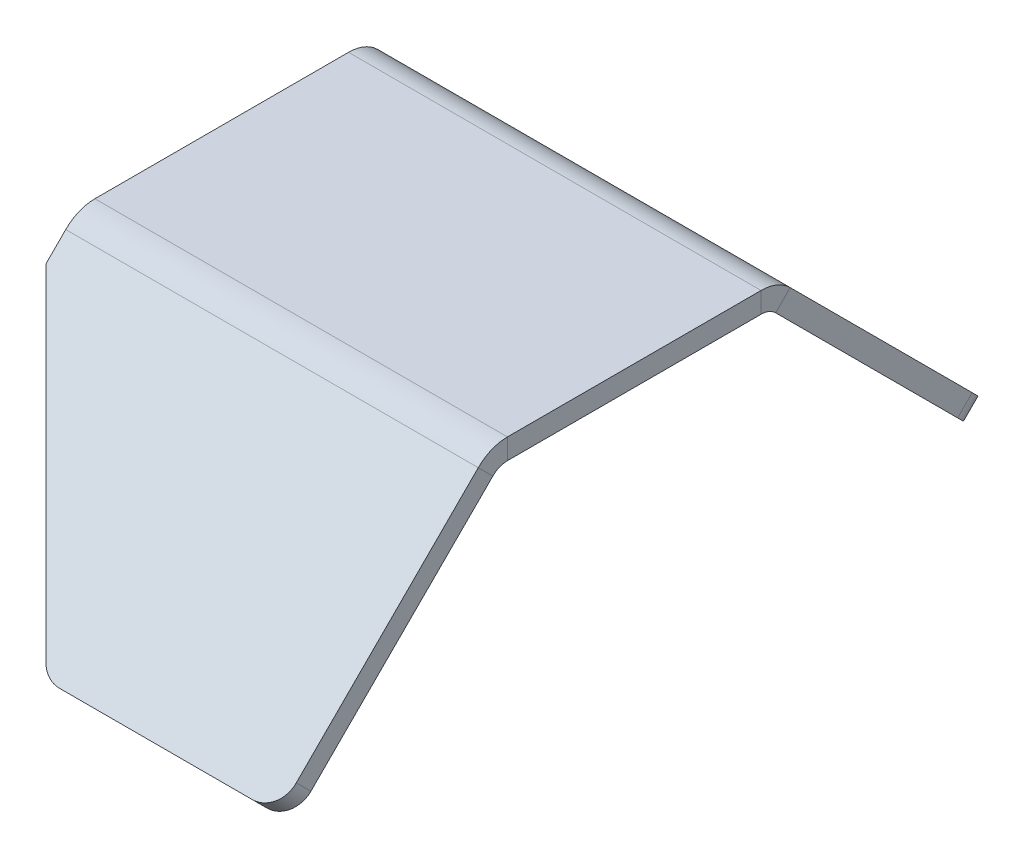
ISO-10303-21;
HEADER;
FILE_DESCRIPTION(('STEP AP214'),'2;1');
FILE_NAME('part.step','',(''),(''),'','','');
FILE_SCHEMA(('AUTOMOTIVE_DESIGN { 1 0 10303 214 1 1 1 1 }'));
ENDSEC;
DATA;
#1=APPLICATION_CONTEXT('core data for automotive mechanical design processes');
#2=APPLICATION_PROTOCOL_DEFINITION('international standard','automotive_design',2000,#1);
#3=PRODUCT_CONTEXT('',#1,'mechanical');
#4=PRODUCT('Part','Part','',(#3));
#5=PRODUCT_RELATED_PRODUCT_CATEGORY('part','',(#4));
#6=PRODUCT_DEFINITION_FORMATION('','',#4);
#7=PRODUCT_DEFINITION_CONTEXT('part definition',#1,'design');
#8=PRODUCT_DEFINITION('design','',#6,#7);
#9=PRODUCT_DEFINITION_SHAPE('','',#8);
#10=(LENGTH_UNIT() NAMED_UNIT(*) SI_UNIT(.MILLI.,.METRE.));
#11=(NAMED_UNIT(*) PLANE_ANGLE_UNIT() SI_UNIT($,.RADIAN.));
#12=(NAMED_UNIT(*) SI_UNIT($,.STERADIAN.) SOLID_ANGLE_UNIT());
#13=UNCERTAINTY_MEASURE_WITH_UNIT(LENGTH_MEASURE(1.E-05),#10,'distance_accuracy_value','');
#14=(GEOMETRIC_REPRESENTATION_CONTEXT(3) GLOBAL_UNCERTAINTY_ASSIGNED_CONTEXT((#13)) GLOBAL_UNIT_ASSIGNED_CONTEXT((#10,
#11,#12)) REPRESENTATION_CONTEXT('',''));
#15=CARTESIAN_POINT('',(0.,0.,0.));
#16=DIRECTION('',(0.,0.,1.));
#17=DIRECTION('',(1.,0.,0.));
#18=AXIS2_PLACEMENT_3D('',#15,#16,#17);
#19=CARTESIAN_POINT('',(0.,8.00000000000001,-49.1862915010152));
#20=DIRECTION('',(-1.,0.,0.));
#21=DIRECTION('',(0.,0.,1.));
#22=AXIS2_PLACEMENT_3D('',#19,#20,#21);
#23=PLANE('',#22);
#24=DIRECTION('',(0.,0.707106781186544,0.707106781186551));
#25=VECTOR('',#24,1.);
#26=CARTESIAN_POINT('',(0.,5.65685424949242,-58.1568542494924));
#27=LINE('',#26,#25);
#28=CARTESIAN_POINT('',(0.,-4.34314575050755,-68.1568542494924));
#29=VERTEX_POINT('',#28);
#30=CARTESIAN_POINT('',(0.,3.31370849898484,-60.4999999999999));
#31=VERTEX_POINT('',#30);
#32=EDGE_CURVE('E206',#29,#31,#27,.T.);
#33=ORIENTED_EDGE('',*,*,#32,.F.);
#34=DIRECTION('',(0.,-0.707106781186551,0.707106781186544));
#35=VECTOR('',#34,1.);
#36=CARTESIAN_POINT('',(0.,-9.99999999999998,-62.5000000000001));
#37=LINE('',#36,#35);
#38=CARTESIAN_POINT('',(0.,-9.99999999999998,-62.5000000000001));
#39=VERTEX_POINT('',#38);
#40=EDGE_CURVE('E187',#39,#29,#37,.F.);
#41=ORIENTED_EDGE('',*,*,#40,.F.);
#42=DIRECTION('',(0.,0.707106781186544,0.707106781186551));
#43=VECTOR('',#42,1.);
#44=CARTESIAN_POINT('',(0.,0.,-52.5));
#45=LINE('',#44,#43);
#46=CARTESIAN_POINT('',(0.,-2.34314575050756,-54.8431457505076));
#47=VERTEX_POINT('',#46);
#48=EDGE_CURVE('E204',#39,#47,#45,.T.);
#49=ORIENTED_EDGE('',*,*,#48,.T.);
#50=DIRECTION('',(0.,0.707106781186551,-0.707106781186544));
#51=VECTOR('',#50,1.);
#52=CARTESIAN_POINT('',(0.,-2.34314575050756,-54.8431457505076));
#53=LINE('',#52,#51);
#54=EDGE_CURVE('E261',#47,#31,#53,.T.);
#55=ORIENTED_EDGE('',*,*,#54,.T.);
#56=EDGE_LOOP('',(#33,#41,#49,#55));
#57=FACE_BOUND('',#56,.T.);
#58=ADVANCED_FACE('F38',(#57),#23,.T.);
#59=CARTESIAN_POINT('',(160.,5.65685424949241,58.1568542494924));
#60=DIRECTION('',(0.,-0.707106781186551,-0.707106781186544));
#61=DIRECTION('',(0.,0.707106781186544,-0.707106781186551));
#62=AXIS2_PLACEMENT_3D('',#59,#60,#61);
#63=PLANE('',#62);
#64=DIRECTION('',(-1.,0.,0.));
#65=VECTOR('',#64,1.);
#66=CARTESIAN_POINT('',(160.,-74.3431457505076,138.156854249493));
#67=LINE('',#66,#65);
#68=CARTESIAN_POINT('',(150.,-74.3431457505076,138.156854249493));
#69=VERTEX_POINT('',#68);
#70=CARTESIAN_POINT('',(75.1763809020504,-74.3431457505076,138.156854249493));
#71=VERTEX_POINT('',#70);
#72=EDGE_CURVE('E249',#69,#71,#67,.T.);
#73=ORIENTED_EDGE('',*,*,#72,.F.);
#74=CARTESIAN_POINT('',(150.,-67.2720779386421,131.085786437628));
#75=DIRECTION('',(0.,-0.707106781186551,-0.707106781186544));
#76=DIRECTION('',(0.,0.707106781186544,-0.707106781186551));
#77=AXIS2_PLACEMENT_3D('',#74,#75,#76);
#78=CIRCLE('',#77,10.);
#79=CARTESIAN_POINT('',(160.,-67.2720779386422,131.085786437628));
#80=VERTEX_POINT('',#79);
#81=EDGE_CURVE('E276',#69,#80,#78,.F.);
#82=ORIENTED_EDGE('',*,*,#81,.T.);
#83=DIRECTION('',(0.,-0.707106781186544,0.707106781186551));
#84=VECTOR('',#83,1.);
#85=CARTESIAN_POINT('',(160.,5.65685424949241,58.1568542494924));
#86=LINE('',#85,#84);
#87=CARTESIAN_POINT('',(160.,3.31370849898482,60.5));
#88=VERTEX_POINT('',#87);
#89=EDGE_CURVE('E217',#88,#80,#86,.T.);
#90=ORIENTED_EDGE('',*,*,#89,.F.);
#91=DIRECTION('',(-1.,0.,0.));
#92=VECTOR('',#91,1.);
#93=CARTESIAN_POINT('',(160.,3.31370849898482,60.5));
#94=LINE('',#93,#92);
#95=CARTESIAN_POINT('',(0.,3.31370849898482,60.5));
#96=VERTEX_POINT('',#95);
#97=EDGE_CURVE('E218',#88,#96,#94,.T.);
#98=ORIENTED_EDGE('',*,*,#97,.T.);
#99=DIRECTION('',(0.,-0.707106781186544,0.707106781186551));
#100=VECTOR('',#99,1.);
#101=CARTESIAN_POINT('',(0.,5.65685424949241,58.1568542494924));
#102=LINE('',#101,#100);
#103=CARTESIAN_POINT('',(0.,-4.34314575050758,68.1568542494924));
#104=VERTEX_POINT('',#103);
#105=EDGE_CURVE('E175',#96,#104,#102,.T.);
#106=ORIENTED_EDGE('',*,*,#105,.T.);
#107=DIRECTION('',(0.577350269189624,-0.577350269189624,0.57735026918963));
#108=VECTOR('',#107,1.);
#109=CARTESIAN_POINT('',(46.6666666666663,-51.0098124171739,114.823520916159));
#110=LINE('',#109,#108);
#111=CARTESIAN_POINT('',(67.0114150927731,-71.3545608432807,135.168269342266));
#112=VERTEX_POINT('',#111);
#113=EDGE_CURVE('E170',#104,#112,#110,.T.);
#114=ORIENTED_EDGE('',*,*,#113,.T.);
#115=CARTESIAN_POINT('',(75.1763809020504,-67.2720779386421,131.085786437628));
#116=DIRECTION('',(0.,-0.707106781186551,-0.707106781186544));
#117=DIRECTION('',(0.,0.707106781186544,-0.707106781186551));
#118=AXIS2_PLACEMENT_3D('',#115,#116,#117);
#119=CIRCLE('',#118,10.);
#120=EDGE_CURVE('E274',#112,#71,#119,.F.);
#121=ORIENTED_EDGE('',*,*,#120,.T.);
#122=EDGE_LOOP('',(#73,#82,#90,#98,#106,#114,#121));
#123=FACE_BOUND('',#122,.T.);
#124=ADVANCED_FACE('F353',(#123),#63,.F.);
#125=CARTESIAN_POINT('',(160.,-80.,132.500000000001));
#126=DIRECTION('',(0.,-0.707106781186542,0.707106781186554));
#127=DIRECTION('',(0.,-0.707106781186554,-0.707106781186542));
#128=AXIS2_PLACEMENT_3D('',#125,#126,#127);
#129=PLANE('',#128);
#130=DIRECTION('',(-1.,0.,0.));
#131=VECTOR('',#130,1.);
#132=CARTESIAN_POINT('',(160.,-80.,132.500000000001));
#133=LINE('',#132,#131);
#134=CARTESIAN_POINT('',(150.,-80.,132.500000000001));
#135=VERTEX_POINT('',#134);
#136=CARTESIAN_POINT('',(75.1763809020505,-80.,132.500000000001));
#137=VERTEX_POINT('',#136);
#138=EDGE_CURVE('E247',#135,#137,#133,.T.);
#139=ORIENTED_EDGE('',*,*,#138,.F.);
#140=DIRECTION('',(0.,0.707106781186554,0.707106781186542));
#141=VECTOR('',#140,1.);
#142=CARTESIAN_POINT('',(150.,-80.,132.500000000001));
#143=LINE('',#142,#141);
#144=EDGE_CURVE('E271',#135,#69,#143,.T.);
#145=ORIENTED_EDGE('',*,*,#144,.T.);
#146=ORIENTED_EDGE('',*,*,#72,.T.);
#147=DIRECTION('',(0.,-0.707106781186554,-0.707106781186542));
#148=VECTOR('',#147,1.);
#149=CARTESIAN_POINT('',(75.1763809020505,-80.0000000000002,132.500000000001));
#150=LINE('',#149,#148);
#151=EDGE_CURVE('E269',#71,#137,#150,.T.);
#152=ORIENTED_EDGE('',*,*,#151,.T.);
#153=EDGE_LOOP('',(#139,#145,#146,#152));
#154=FACE_BOUND('',#153,.T.);
#155=ADVANCED_FACE('F406',(#154),#129,.T.);
#156=CARTESIAN_POINT('',(160.,0.,52.5));
#157=DIRECTION('',(0.,-0.707106781186551,-0.707106781186544));
#158=DIRECTION('',(0.,0.707106781186544,-0.707106781186551));
#159=AXIS2_PLACEMENT_3D('',#156,#157,#158);
#160=PLANE('',#159);
#161=DIRECTION('',(0.,-0.707106781186544,0.707106781186551));
#162=VECTOR('',#161,1.);
#163=CARTESIAN_POINT('',(160.,0.,52.5));
#164=LINE('',#163,#162);
#165=CARTESIAN_POINT('',(160.,-2.34314575050759,54.8431457505076));
#166=VERTEX_POINT('',#165);
#167=CARTESIAN_POINT('',(160.,-72.9289321881346,125.428932188135));
#168=VERTEX_POINT('',#167);
#169=EDGE_CURVE('E356',#166,#168,#164,.T.);
#170=ORIENTED_EDGE('',*,*,#169,.T.);
#171=CARTESIAN_POINT('',(150.,-72.9289321881346,125.428932188135));
#172=DIRECTION('',(0.,-0.707106781186551,-0.707106781186544));
#173=DIRECTION('',(0.,0.707106781186544,-0.707106781186551));
#174=AXIS2_PLACEMENT_3D('',#171,#172,#173);
#175=CIRCLE('',#174,10.);
#176=EDGE_CURVE('E281',#168,#135,#175,.T.);
#177=ORIENTED_EDGE('',*,*,#176,.T.);
#178=ORIENTED_EDGE('',*,*,#138,.T.);
#179=CARTESIAN_POINT('',(75.1763809020505,-72.9289321881346,125.428932188135));
#180=DIRECTION('',(0.,-0.707106781186551,-0.707106781186544));
#181=DIRECTION('',(0.,0.707106781186544,-0.707106781186551));
#182=AXIS2_PLACEMENT_3D('',#179,#180,#181);
#183=CIRCLE('',#182,10.);
#184=CARTESIAN_POINT('',(67.0114150927731,-77.0114150927731,129.511415092774));
#185=VERTEX_POINT('',#184);
#186=EDGE_CURVE('E186',#137,#185,#183,.T.);
#187=ORIENTED_EDGE('',*,*,#186,.T.);
#188=DIRECTION('',(0.577350269189624,-0.577350269189624,0.57735026918963));
#189=VECTOR('',#188,1.);
#190=CARTESIAN_POINT('',(46.6666666666663,-56.6666666666663,109.166666666667));
#191=LINE('',#190,#189);
#192=CARTESIAN_POINT('',(0.,-10.,62.5000000000001));
#193=VERTEX_POINT('',#192);
#194=EDGE_CURVE('E167',#193,#185,#191,.T.);
#195=ORIENTED_EDGE('',*,*,#194,.F.);
#196=DIRECTION('',(0.,-0.707106781186544,0.707106781186551));
#197=VECTOR('',#196,1.);
#198=CARTESIAN_POINT('',(0.,0.,52.5));
#199=LINE('',#198,#197);
#200=CARTESIAN_POINT('',(0.,-2.34314575050759,54.8431457505076));
#201=VERTEX_POINT('',#200);
#202=EDGE_CURVE('E182',#201,#193,#199,.T.);
#203=ORIENTED_EDGE('',*,*,#202,.F.);
#204=DIRECTION('',(-1.,0.,0.));
#205=VECTOR('',#204,1.);
#206=CARTESIAN_POINT('',(160.,-2.34314575050759,54.8431457505076));
#207=LINE('',#206,#205);
#208=EDGE_CURVE('E245',#166,#201,#207,.T.);
#209=ORIENTED_EDGE('',*,*,#208,.F.);
#210=EDGE_LOOP('',(#170,#177,#178,#187,#195,#203,#209));
#211=FACE_BOUND('',#210,.T.);
#212=ADVANCED_FACE('F180',(#211),#160,.T.);
#213=CARTESIAN_POINT('',(160.,0.,-52.5));
#214=DIRECTION('',(0.,-0.707106781186551,0.707106781186544));
#215=DIRECTION('',(0.,-0.707106781186544,-0.707106781186551));
#216=AXIS2_PLACEMENT_3D('',#213,#214,#215);
#217=PLANE('',#216);
#218=DIRECTION('',(-1.,0.,0.));
#219=VECTOR('',#218,1.);
#220=CARTESIAN_POINT('',(160.,-80.,-132.500000000001));
#221=LINE('',#220,#219);
#222=CARTESIAN_POINT('',(150.,-80.,-132.500000000001));
#223=VERTEX_POINT('',#222);
#224=CARTESIAN_POINT('',(75.1763809020504,-80.,-132.500000000001));
#225=VERTEX_POINT('',#224);
#226=EDGE_CURVE('E233',#223,#225,#221,.T.);
#227=ORIENTED_EDGE('',*,*,#226,.F.);
#228=CARTESIAN_POINT('',(150.,-72.9289321881345,-125.428932188135));
#229=DIRECTION('',(0.,-0.707106781186551,0.707106781186544));
#230=DIRECTION('',(0.,-0.707106781186544,-0.707106781186551));
#231=AXIS2_PLACEMENT_3D('',#228,#229,#230);
#232=CIRCLE('',#231,10.);
#233=CARTESIAN_POINT('',(160.,-72.9289321881346,-125.428932188135));
#234=VERTEX_POINT('',#233);
#235=EDGE_CURVE('E291',#223,#234,#232,.T.);
#236=ORIENTED_EDGE('',*,*,#235,.T.);
#237=DIRECTION('',(0.,0.707106781186544,0.707106781186551));
#238=VECTOR('',#237,1.);
#239=CARTESIAN_POINT('',(160.,0.,-52.5));
#240=LINE('',#239,#238);
#241=CARTESIAN_POINT('',(160.,-2.34314575050756,-54.8431457505076));
#242=VERTEX_POINT('',#241);
#243=EDGE_CURVE('E323',#234,#242,#240,.T.);
#244=ORIENTED_EDGE('',*,*,#243,.T.);
#245=DIRECTION('',(-1.,0.,0.));
#246=VECTOR('',#245,1.);
#247=CARTESIAN_POINT('',(160.,-2.34314575050756,-54.8431457505076));
#248=LINE('',#247,#246);
#249=EDGE_CURVE('E236',#242,#47,#248,.T.);
#250=ORIENTED_EDGE('',*,*,#249,.T.);
#251=ORIENTED_EDGE('',*,*,#48,.F.);
#252=DIRECTION('',(-0.577350269189624,0.577350269189624,0.57735026918963));
#253=VECTOR('',#252,1.);
#254=CARTESIAN_POINT('',(46.6666666666663,-56.6666666666663,-109.166666666667));
#255=LINE('',#254,#253);
#256=CARTESIAN_POINT('',(67.0114150927732,-77.0114150927731,-129.511415092774));
#257=VERTEX_POINT('',#256);
#258=EDGE_CURVE('E301',#257,#39,#255,.T.);
#259=ORIENTED_EDGE('',*,*,#258,.F.);
#260=CARTESIAN_POINT('',(75.1763809020504,-72.9289321881345,-125.428932188135));
#261=DIRECTION('',(0.,-0.707106781186551,0.707106781186544));
#262=DIRECTION('',(0.,-0.707106781186544,-0.707106781186551));
#263=AXIS2_PLACEMENT_3D('',#260,#261,#262);
#264=CIRCLE('',#263,10.);
#265=EDGE_CURVE('E289',#257,#225,#264,.T.);
#266=ORIENTED_EDGE('',*,*,#265,.T.);
#267=EDGE_LOOP('',(#227,#236,#244,#250,#251,#259,#266));
#268=FACE_BOUND('',#267,.T.);
#269=ADVANCED_FACE('F309',(#268),#217,.T.);
#270=CARTESIAN_POINT('',(160.,-74.3431457505076,-138.156854249493));
#271=DIRECTION('',(0.,-0.707106781186545,-0.70710678118655));
#272=DIRECTION('',(0.,0.70710678118655,-0.707106781186545));
#273=AXIS2_PLACEMENT_3D('',#270,#271,#272);
#274=PLANE('',#273);
#275=DIRECTION('',(-1.,0.,0.));
#276=VECTOR('',#275,1.);
#277=CARTESIAN_POINT('',(160.,-74.3431457505076,-138.156854249493));
#278=LINE('',#277,#276);
#279=CARTESIAN_POINT('',(150.,-74.3431457505076,-138.156854249493));
#280=VERTEX_POINT('',#279);
#281=CARTESIAN_POINT('',(75.1763809020504,-74.3431457505076,-138.156854249493));
#282=VERTEX_POINT('',#281);
#283=EDGE_CURVE('E231',#280,#282,#278,.T.);
#284=ORIENTED_EDGE('',*,*,#283,.F.);
#285=DIRECTION('',(0.,-0.70710678118655,0.707106781186545));
#286=VECTOR('',#285,1.);
#287=CARTESIAN_POINT('',(150.,-80.,-132.500000000001));
#288=LINE('',#287,#286);
#289=EDGE_CURVE('E286',#280,#223,#288,.T.);
#290=ORIENTED_EDGE('',*,*,#289,.T.);
#291=ORIENTED_EDGE('',*,*,#226,.T.);
#292=DIRECTION('',(0.,-0.70710678118655,0.707106781186545));
#293=VECTOR('',#292,1.);
#294=CARTESIAN_POINT('',(75.1763809020504,-74.3431457505075,-138.156854249493));
#295=LINE('',#294,#293);
#296=EDGE_CURVE('E283',#225,#282,#295,.F.);
#297=ORIENTED_EDGE('',*,*,#296,.T.);
#298=EDGE_LOOP('',(#284,#290,#291,#297));
#299=FACE_BOUND('',#298,.T.);
#300=ADVANCED_FACE('F315',(#299),#274,.T.);
#301=CARTESIAN_POINT('',(160.,5.65685424949242,-58.1568542494924));
#302=DIRECTION('',(0.,-0.707106781186551,0.707106781186544));
#303=DIRECTION('',(0.,-0.707106781186544,-0.707106781186551));
#304=AXIS2_PLACEMENT_3D('',#301,#302,#303);
#305=PLANE('',#304);
#306=DIRECTION('',(0.,0.707106781186544,0.707106781186551));
#307=VECTOR('',#306,1.);
#308=CARTESIAN_POINT('',(160.,5.65685424949242,-58.1568542494924));
#309=LINE('',#308,#307);
#310=CARTESIAN_POINT('',(160.,-67.2720779386422,-131.085786437628));
#311=VERTEX_POINT('',#310);
#312=CARTESIAN_POINT('',(160.,3.31370849898484,-60.4999999999999));
#313=VERTEX_POINT('',#312);
#314=EDGE_CURVE('E320',#311,#313,#309,.T.);
#315=ORIENTED_EDGE('',*,*,#314,.F.);
#316=CARTESIAN_POINT('',(150.,-67.2720779386421,-131.085786437628));
#317=DIRECTION('',(0.,-0.707106781186551,0.707106781186544));
#318=DIRECTION('',(0.,-0.707106781186544,-0.707106781186551));
#319=AXIS2_PLACEMENT_3D('',#316,#317,#318);
#320=CIRCLE('',#319,10.);
#321=EDGE_CURVE('E295',#311,#280,#320,.F.);
#322=ORIENTED_EDGE('',*,*,#321,.T.);
#323=ORIENTED_EDGE('',*,*,#283,.T.);
#324=CARTESIAN_POINT('',(75.1763809020504,-67.2720779386421,-131.085786437628));
#325=DIRECTION('',(0.,-0.707106781186551,0.707106781186544));
#326=DIRECTION('',(0.,-0.707106781186544,-0.707106781186551));
#327=AXIS2_PLACEMENT_3D('',#324,#325,#326);
#328=CIRCLE('',#327,10.);
#329=CARTESIAN_POINT('',(67.0114150927732,-71.3545608432807,-135.168269342266));
#330=VERTEX_POINT('',#329);
#331=EDGE_CURVE('E53',#282,#330,#328,.F.);
#332=ORIENTED_EDGE('',*,*,#331,.T.);
#333=DIRECTION('',(-0.577350269189624,0.577350269189624,0.57735026918963));
#334=VECTOR('',#333,1.);
#335=CARTESIAN_POINT('',(46.6666666666663,-51.0098124171738,-114.823520916159));
#336=LINE('',#335,#334);
#337=EDGE_CURVE('E303',#330,#29,#336,.T.);
#338=ORIENTED_EDGE('',*,*,#337,.T.);
#339=ORIENTED_EDGE('',*,*,#32,.T.);
#340=DIRECTION('',(-1.,0.,0.));
#341=VECTOR('',#340,1.);
#342=CARTESIAN_POINT('',(160.,3.31370849898484,-60.4999999999999));
#343=LINE('',#342,#341);
#344=EDGE_CURVE('E228',#313,#31,#343,.T.);
#345=ORIENTED_EDGE('',*,*,#344,.F.);
#346=EDGE_LOOP('',(#315,#322,#323,#332,#338,#339,#345));
#347=FACE_BOUND('',#346,.T.);
#348=ADVANCED_FACE('F317',(#347),#305,.F.);
#349=CARTESIAN_POINT('',(0.,-8.,49.1862915010153));
#350=DIRECTION('',(-1.,0.,0.));
#351=DIRECTION('',(0.,0.,1.));
#352=AXIS2_PLACEMENT_3D('',#349,#350,#351);
#353=PLANE('',#352);
#354=ORIENTED_EDGE('',*,*,#202,.T.);
#355=DIRECTION('',(0.,-0.707106781186551,-0.707106781186544));
#356=VECTOR('',#355,1.);
#357=CARTESIAN_POINT('',(0.,-10.,62.5000000000001));
#358=LINE('',#357,#356);
#359=EDGE_CURVE('E164',#193,#104,#358,.F.);
#360=ORIENTED_EDGE('',*,*,#359,.T.);
#361=ORIENTED_EDGE('',*,*,#105,.F.);
#362=DIRECTION('',(0.,-0.707106781186551,-0.707106781186544));
#363=VECTOR('',#362,1.);
#364=CARTESIAN_POINT('',(0.,3.31370849898482,60.5));
#365=LINE('',#364,#363);
#366=EDGE_CURVE('E190',#96,#201,#365,.T.);
#367=ORIENTED_EDGE('',*,*,#366,.T.);
#368=EDGE_LOOP('',(#354,#360,#361,#367));
#369=FACE_BOUND('',#368,.T.);
#370=ADVANCED_FACE('F189',(#369),#353,.T.);
#371=CARTESIAN_POINT('',(160.,0.,-49.1862915010152));
#372=DIRECTION('',(1.,0.,0.));
#373=DIRECTION('',(0.,0.,-1.));
#374=AXIS2_PLACEMENT_3D('',#371,#372,#373);
#375=PLANE('',#374);
#376=DIRECTION('',(0.,1.,0.));
#377=VECTOR('',#376,1.);
#378=CARTESIAN_POINT('',(160.,0.,-49.1862915010152));
#379=LINE('',#378,#377);
#380=CARTESIAN_POINT('',(160.,0.,-49.1862915010152));
#381=VERTEX_POINT('',#380);
#382=CARTESIAN_POINT('',(160.,8.00000000000001,-49.1862915010152));
#383=VERTEX_POINT('',#382);
#384=EDGE_CURVE('E267',#381,#383,#379,.T.);
#385=ORIENTED_EDGE('',*,*,#384,.F.);
#386=CARTESIAN_POINT('',(160.,-7.99999999999998,-49.1862915010152));
#387=DIRECTION('',(-1.,0.,0.));
#388=DIRECTION('',(0.,0.,1.));
#389=AXIS2_PLACEMENT_3D('',#386,#387,#388);
#390=CIRCLE('',#389,8.);
#391=EDGE_CURVE('E327',#242,#381,#390,.F.);
#392=ORIENTED_EDGE('',*,*,#391,.F.);
#393=DIRECTION('',(0.,-0.707106781186551,0.707106781186544));
#394=VECTOR('',#393,1.);
#395=CARTESIAN_POINT('',(160.,3.31370849898484,-60.4999999999999));
#396=LINE('',#395,#394);
#397=EDGE_CURVE('E264',#313,#242,#396,.T.);
#398=ORIENTED_EDGE('',*,*,#397,.F.);
#399=CARTESIAN_POINT('',(160.,-7.99999999999998,-49.1862915010152));
#400=DIRECTION('',(1.,0.,0.));
#401=DIRECTION('',(0.,0.,-1.));
#402=AXIS2_PLACEMENT_3D('',#399,#400,#401);
#403=CIRCLE('',#402,16.);
#404=EDGE_CURVE('E329',#313,#383,#403,.T.);
#405=ORIENTED_EDGE('',*,*,#404,.T.);
#406=EDGE_LOOP('',(#385,#392,#398,#405));
#407=FACE_BOUND('',#406,.T.);
#408=ADVANCED_FACE('F378',(#407),#375,.T.);
#409=CARTESIAN_POINT('',(160.,3.31370849898484,-60.4999999999999));
#410=DIRECTION('',(1.,0.,0.));
#411=DIRECTION('',(0.,0.,-1.));
#412=AXIS2_PLACEMENT_3D('',#409,#410,#411);
#413=PLANE('',#412);
#414=DIRECTION('',(0.,0.,1.));
#415=VECTOR('',#414,1.);
#416=CARTESIAN_POINT('',(160.,0.,52.5));
#417=LINE('',#416,#415);
#418=CARTESIAN_POINT('',(160.,0.,49.1862915010153));
#419=VERTEX_POINT('',#418);
#420=EDGE_CURVE('E332',#381,#419,#417,.T.);
#421=ORIENTED_EDGE('',*,*,#420,.F.);
#422=ORIENTED_EDGE('',*,*,#384,.T.);
#423=DIRECTION('',(0.,0.,1.));
#424=VECTOR('',#423,1.);
#425=CARTESIAN_POINT('',(160.,8.,52.5));
#426=LINE('',#425,#424);
#427=CARTESIAN_POINT('',(160.,8.,49.1862915010153));
#428=VERTEX_POINT('',#427);
#429=EDGE_CURVE('E338',#383,#428,#426,.T.);
#430=ORIENTED_EDGE('',*,*,#429,.T.);
#431=DIRECTION('',(0.,-1.,0.));
#432=VECTOR('',#431,1.);
#433=CARTESIAN_POINT('',(160.,8.,49.1862915010153));
#434=LINE('',#433,#432);
#435=EDGE_CURVE('E255',#428,#419,#434,.T.);
#436=ORIENTED_EDGE('',*,*,#435,.T.);
#437=EDGE_LOOP('',(#421,#422,#430,#436));
#438=FACE_BOUND('',#437,.T.);
#439=ADVANCED_FACE('F372',(#438),#413,.T.);
#440=CARTESIAN_POINT('',(0.,-2.34314575050756,-54.8431457505076));
#441=DIRECTION('',(-1.,0.,0.));
#442=DIRECTION('',(0.,0.,1.));
#443=AXIS2_PLACEMENT_3D('',#440,#441,#442);
#444=PLANE('',#443);
#445=ORIENTED_EDGE('',*,*,#54,.F.);
#446=CARTESIAN_POINT('',(0.,-7.99999999999998,-49.1862915010152));
#447=DIRECTION('',(-1.,0.,0.));
#448=DIRECTION('',(0.,0.,1.));
#449=AXIS2_PLACEMENT_3D('',#446,#447,#448);
#450=CIRCLE('',#449,8.);
#451=CARTESIAN_POINT('',(0.,0.,-49.1862915010152));
#452=VERTEX_POINT('',#451);
#453=EDGE_CURVE('E201',#47,#452,#450,.F.);
#454=ORIENTED_EDGE('',*,*,#453,.T.);
#455=DIRECTION('',(0.,-1.,0.));
#456=VECTOR('',#455,1.);
#457=CARTESIAN_POINT('',(0.,8.00000000000001,-49.1862915010152));
#458=LINE('',#457,#456);
#459=CARTESIAN_POINT('',(0.,8.00000000000001,-49.1862915010152));
#460=VERTEX_POINT('',#459);
#461=EDGE_CURVE('E259',#460,#452,#458,.T.);
#462=ORIENTED_EDGE('',*,*,#461,.F.);
#463=CARTESIAN_POINT('',(0.,-7.99999999999998,-49.1862915010152));
#464=DIRECTION('',(1.,0.,0.));
#465=DIRECTION('',(0.,0.,-1.));
#466=AXIS2_PLACEMENT_3D('',#463,#464,#465);
#467=CIRCLE('',#466,16.);
#468=EDGE_CURVE('E208',#31,#460,#467,.T.);
#469=ORIENTED_EDGE('',*,*,#468,.F.);
#470=EDGE_LOOP('',(#445,#454,#462,#469));
#471=FACE_BOUND('',#470,.T.);
#472=ADVANCED_FACE('F397',(#471),#444,.T.);
#473=CARTESIAN_POINT('',(160.,-2.34314575050759,54.8431457505076));
#474=DIRECTION('',(1.,0.,0.));
#475=DIRECTION('',(0.,0.,-1.));
#476=AXIS2_PLACEMENT_3D('',#473,#474,#475);
#477=PLANE('',#476);
#478=DIRECTION('',(0.,0.707106781186551,0.707106781186544));
#479=VECTOR('',#478,1.);
#480=CARTESIAN_POINT('',(160.,-2.34314575050759,54.8431457505076));
#481=LINE('',#480,#479);
#482=EDGE_CURVE('E257',#166,#88,#481,.T.);
#483=ORIENTED_EDGE('',*,*,#482,.F.);
#484=CARTESIAN_POINT('',(160.,-8.,49.1862915010153));
#485=DIRECTION('',(-1.,0.,0.));
#486=DIRECTION('',(0.,0.,1.));
#487=AXIS2_PLACEMENT_3D('',#484,#485,#486);
#488=CIRCLE('',#487,8.);
#489=EDGE_CURVE('E358',#419,#166,#488,.F.);
#490=ORIENTED_EDGE('',*,*,#489,.F.);
#491=ORIENTED_EDGE('',*,*,#435,.F.);
#492=CARTESIAN_POINT('',(160.,-8.,49.1862915010153));
#493=DIRECTION('',(1.,0.,0.));
#494=DIRECTION('',(0.,0.,-1.));
#495=AXIS2_PLACEMENT_3D('',#492,#493,#494);
#496=CIRCLE('',#495,16.);
#497=EDGE_CURVE('E222',#428,#88,#496,.T.);
#498=ORIENTED_EDGE('',*,*,#497,.T.);
#499=EDGE_LOOP('',(#483,#490,#491,#498));
#500=FACE_BOUND('',#499,.T.);
#501=ADVANCED_FACE('F344',(#500),#477,.T.);
#502=CARTESIAN_POINT('',(160.,8.,49.1862915010153));
#503=DIRECTION('',(1.,0.,0.));
#504=DIRECTION('',(0.,0.,-1.));
#505=AXIS2_PLACEMENT_3D('',#502,#503,#504);
#506=PLANE('',#505);
#507=ORIENTED_EDGE('',*,*,#89,.T.);
#508=DIRECTION('',(0.,0.707106781186554,0.707106781186542));
#509=VECTOR('',#508,1.);
#510=CARTESIAN_POINT('',(160.,-70.5857864376266,127.772077938643));
#511=LINE('',#510,#509);
#512=EDGE_CURVE('E278',#80,#168,#511,.F.);
#513=ORIENTED_EDGE('',*,*,#512,.T.);
#514=ORIENTED_EDGE('',*,*,#169,.F.);
#515=ORIENTED_EDGE('',*,*,#482,.T.);
#516=EDGE_LOOP('',(#507,#513,#514,#515));
#517=FACE_BOUND('',#516,.T.);
#518=ADVANCED_FACE('F615',(#517),#506,.T.);
#519=CARTESIAN_POINT('',(0.,0.,49.1862915010153));
#520=DIRECTION('',(-1.,0.,0.));
#521=DIRECTION('',(0.,0.,1.));
#522=AXIS2_PLACEMENT_3D('',#519,#520,#521);
#523=PLANE('',#522);
#524=DIRECTION('',(0.,1.,0.));
#525=VECTOR('',#524,1.);
#526=CARTESIAN_POINT('',(0.,0.,49.1862915010153));
#527=LINE('',#526,#525);
#528=CARTESIAN_POINT('',(0.,0.,49.1862915010153));
#529=VERTEX_POINT('',#528);
#530=CARTESIAN_POINT('',(0.,8.,49.1862915010153));
#531=VERTEX_POINT('',#530);
#532=EDGE_CURVE('E253',#529,#531,#527,.T.);
#533=ORIENTED_EDGE('',*,*,#532,.F.);
#534=CARTESIAN_POINT('',(0.,-8.,49.1862915010153));
#535=DIRECTION('',(-1.,0.,0.));
#536=DIRECTION('',(0.,0.,1.));
#537=AXIS2_PLACEMENT_3D('',#534,#535,#536);
#538=CIRCLE('',#537,8.);
#539=EDGE_CURVE('E192',#529,#201,#538,.F.);
#540=ORIENTED_EDGE('',*,*,#539,.T.);
#541=ORIENTED_EDGE('',*,*,#366,.F.);
#542=CARTESIAN_POINT('',(0.,-8.,49.1862915010153));
#543=DIRECTION('',(1.,0.,0.));
#544=DIRECTION('',(0.,0.,-1.));
#545=AXIS2_PLACEMENT_3D('',#542,#543,#544);
#546=CIRCLE('',#545,16.);
#547=EDGE_CURVE('E214',#531,#96,#546,.T.);
#548=ORIENTED_EDGE('',*,*,#547,.F.);
#549=EDGE_LOOP('',(#533,#540,#541,#548));
#550=FACE_BOUND('',#549,.T.);
#551=ADVANCED_FACE('F390',(#550),#523,.T.);
#552=CARTESIAN_POINT('',(0.,3.31370849898482,60.5));
#553=DIRECTION('',(-1.,0.,0.));
#554=DIRECTION('',(0.,0.,1.));
#555=AXIS2_PLACEMENT_3D('',#552,#553,#554);
#556=PLANE('',#555);
#557=DIRECTION('',(0.,0.,1.));
#558=VECTOR('',#557,1.);
#559=CARTESIAN_POINT('',(0.,0.,52.5));
#560=LINE('',#559,#558);
#561=EDGE_CURVE('E194',#452,#529,#560,.T.);
#562=ORIENTED_EDGE('',*,*,#561,.T.);
#563=ORIENTED_EDGE('',*,*,#532,.T.);
#564=DIRECTION('',(0.,0.,1.));
#565=VECTOR('',#564,1.);
#566=CARTESIAN_POINT('',(0.,8.,52.5));
#567=LINE('',#566,#565);
#568=EDGE_CURVE('E211',#460,#531,#567,.T.);
#569=ORIENTED_EDGE('',*,*,#568,.F.);
#570=ORIENTED_EDGE('',*,*,#461,.T.);
#571=EDGE_LOOP('',(#562,#563,#569,#570));
#572=FACE_BOUND('',#571,.T.);
#573=ADVANCED_FACE('F394',(#572),#556,.T.);
#574=CARTESIAN_POINT('',(160.,-8.,49.1862915010153));
#575=DIRECTION('',(-1.,0.,0.));
#576=DIRECTION('',(0.,0.,1.));
#577=AXIS2_PLACEMENT_3D('',#574,#575,#576);
#578=CYLINDRICAL_SURFACE('',#577,8.);
#579=ORIENTED_EDGE('',*,*,#539,.F.);
#580=DIRECTION('',(-1.,0.,0.));
#581=VECTOR('',#580,1.);
#582=CARTESIAN_POINT('',(160.,0.,49.1862915010153));
#583=LINE('',#582,#581);
#584=EDGE_CURVE('E242',#419,#529,#583,.T.);
#585=ORIENTED_EDGE('',*,*,#584,.F.);
#586=ORIENTED_EDGE('',*,*,#489,.T.);
#587=ORIENTED_EDGE('',*,*,#208,.T.);
#588=EDGE_LOOP('',(#579,#585,#586,#587));
#589=FACE_BOUND('',#588,.T.);
#590=ADVANCED_FACE('F392',(#589),#578,.F.);
#591=CARTESIAN_POINT('',(160.,0.,52.5));
#592=DIRECTION('',(0.,-1.,0.));
#593=DIRECTION('',(0.,0.,-1.));
#594=AXIS2_PLACEMENT_3D('',#591,#592,#593);
#595=PLANE('',#594);
#596=ORIENTED_EDGE('',*,*,#561,.F.);
#597=DIRECTION('',(-1.,0.,0.));
#598=VECTOR('',#597,1.);
#599=CARTESIAN_POINT('',(160.,0.,-49.1862915010152));
#600=LINE('',#599,#598);
#601=EDGE_CURVE('E239',#381,#452,#600,.T.);
#602=ORIENTED_EDGE('',*,*,#601,.F.);
#603=ORIENTED_EDGE('',*,*,#420,.T.);
#604=ORIENTED_EDGE('',*,*,#584,.T.);
#605=EDGE_LOOP('',(#596,#602,#603,#604));
#606=FACE_BOUND('',#605,.T.);
#607=ADVANCED_FACE('F368',(#606),#595,.T.);
#608=CARTESIAN_POINT('',(160.,-7.99999999999998,-49.1862915010152));
#609=DIRECTION('',(-1.,0.,0.));
#610=DIRECTION('',(0.,0.,1.));
#611=AXIS2_PLACEMENT_3D('',#608,#609,#610);
#612=CYLINDRICAL_SURFACE('',#611,8.);
#613=ORIENTED_EDGE('',*,*,#453,.F.);
#614=ORIENTED_EDGE('',*,*,#249,.F.);
#615=ORIENTED_EDGE('',*,*,#391,.T.);
#616=ORIENTED_EDGE('',*,*,#601,.T.);
#617=EDGE_LOOP('',(#613,#614,#615,#616));
#618=FACE_BOUND('',#617,.T.);
#619=ADVANCED_FACE('F376',(#618),#612,.F.);
#620=CARTESIAN_POINT('',(160.,-7.99999999999998,-49.1862915010152));
#621=DIRECTION('',(-1.,0.,0.));
#622=DIRECTION('',(0.,0.,1.));
#623=AXIS2_PLACEMENT_3D('',#620,#621,#622);
#624=CYLINDRICAL_SURFACE('',#623,16.);
#625=ORIENTED_EDGE('',*,*,#468,.T.);
#626=DIRECTION('',(-1.,0.,0.));
#627=VECTOR('',#626,1.);
#628=CARTESIAN_POINT('',(160.,8.00000000000001,-49.1862915010152));
#629=LINE('',#628,#627);
#630=EDGE_CURVE('E225',#383,#460,#629,.T.);
#631=ORIENTED_EDGE('',*,*,#630,.F.);
#632=ORIENTED_EDGE('',*,*,#404,.F.);
#633=ORIENTED_EDGE('',*,*,#344,.T.);
#634=EDGE_LOOP('',(#625,#631,#632,#633));
#635=FACE_BOUND('',#634,.T.);
#636=ADVANCED_FACE('F383',(#635),#624,.T.);
#637=CARTESIAN_POINT('',(160.,8.,52.5));
#638=DIRECTION('',(0.,-1.,0.));
#639=DIRECTION('',(0.,0.,-1.));
#640=AXIS2_PLACEMENT_3D('',#637,#638,#639);
#641=PLANE('',#640);
#642=ORIENTED_EDGE('',*,*,#568,.T.);
#643=DIRECTION('',(-1.,0.,0.));
#644=VECTOR('',#643,1.);
#645=CARTESIAN_POINT('',(160.,8.,49.1862915010153));
#646=LINE('',#645,#644);
#647=EDGE_CURVE('E221',#428,#531,#646,.T.);
#648=ORIENTED_EDGE('',*,*,#647,.F.);
#649=ORIENTED_EDGE('',*,*,#429,.F.);
#650=ORIENTED_EDGE('',*,*,#630,.T.);
#651=EDGE_LOOP('',(#642,#648,#649,#650));
#652=FACE_BOUND('',#651,.T.);
#653=ADVANCED_FACE('F388',(#652),#641,.F.);
#654=CARTESIAN_POINT('',(160.,-8.,49.1862915010153));
#655=DIRECTION('',(-1.,0.,0.));
#656=DIRECTION('',(0.,0.,1.));
#657=AXIS2_PLACEMENT_3D('',#654,#655,#656);
#658=CYLINDRICAL_SURFACE('',#657,16.);
#659=ORIENTED_EDGE('',*,*,#547,.T.);
#660=ORIENTED_EDGE('',*,*,#97,.F.);
#661=ORIENTED_EDGE('',*,*,#497,.F.);
#662=ORIENTED_EDGE('',*,*,#647,.T.);
#663=EDGE_LOOP('',(#659,#660,#661,#662));
#664=FACE_BOUND('',#663,.T.);
#665=ADVANCED_FACE('F348',(#664),#658,.T.);
#666=CARTESIAN_POINT('',(160.,-8.,49.1862915010153));
#667=DIRECTION('',(-1.,0.,0.));
#668=DIRECTION('',(0.,0.,1.));
#669=AXIS2_PLACEMENT_3D('',#666,#667,#668);
#670=PLANE('',#669);
#671=ORIENTED_EDGE('',*,*,#243,.F.);
#672=DIRECTION('',(0.,-0.70710678118655,0.707106781186545));
#673=VECTOR('',#672,1.);
#674=CARTESIAN_POINT('',(160.,-67.2720779386421,-131.085786437628));
#675=LINE('',#674,#673);
#676=EDGE_CURVE('E61',#234,#311,#675,.F.);
#677=ORIENTED_EDGE('',*,*,#676,.T.);
#678=ORIENTED_EDGE('',*,*,#314,.T.);
#679=ORIENTED_EDGE('',*,*,#397,.T.);
#680=EDGE_LOOP('',(#671,#677,#678,#679));
#681=FACE_BOUND('',#680,.T.);
#682=ADVANCED_FACE('F324',(#681),#670,.F.);
#683=CARTESIAN_POINT('',(46.6666666666663,-56.6666666666663,109.166666666667));
#684=DIRECTION('',(0.816496580927727,0.40824829046386,-0.408248290463864));
#685=DIRECTION('',(0.577350269189624,-0.577350269189624,0.57735026918963));
#686=AXIS2_PLACEMENT_3D('',#683,#684,#685);
#687=PLANE('',#686);
#688=ORIENTED_EDGE('',*,*,#194,.T.);
#689=DIRECTION('',(0.,0.707106781186554,0.707106781186542));
#690=VECTOR('',#689,1.);
#691=CARTESIAN_POINT('',(67.0114150927731,-77.011415092773,129.511415092774));
#692=LINE('',#691,#690);
#693=EDGE_CURVE('E11',#185,#112,#692,.T.);
#694=ORIENTED_EDGE('',*,*,#693,.T.);
#695=ORIENTED_EDGE('',*,*,#113,.F.);
#696=ORIENTED_EDGE('',*,*,#359,.F.);
#697=EDGE_LOOP('',(#688,#694,#695,#696));
#698=FACE_BOUND('',#697,.T.);
#699=ADVANCED_FACE('F166',(#698),#687,.F.);
#700=CARTESIAN_POINT('',(46.6666666666663,-56.6666666666663,-109.166666666667));
#701=DIRECTION('',(0.816496580927727,0.408248290463859,0.408248290463864));
#702=DIRECTION('',(-0.577350269189624,0.577350269189624,0.57735026918963));
#703=AXIS2_PLACEMENT_3D('',#700,#701,#702);
#704=PLANE('',#703);
#705=ORIENTED_EDGE('',*,*,#337,.F.);
#706=DIRECTION('',(0.,0.70710678118655,-0.707106781186545));
#707=VECTOR('',#706,1.);
#708=CARTESIAN_POINT('',(67.0114150927731,-77.0114150927732,-129.511415092774));
#709=LINE('',#708,#707);
#710=EDGE_CURVE('E46',#330,#257,#709,.F.);
#711=ORIENTED_EDGE('',*,*,#710,.T.);
#712=ORIENTED_EDGE('',*,*,#258,.T.);
#713=ORIENTED_EDGE('',*,*,#40,.T.);
#714=EDGE_LOOP('',(#705,#711,#712,#713));
#715=FACE_BOUND('',#714,.T.);
#716=ADVANCED_FACE('F299',(#715),#704,.F.);
#717=CARTESIAN_POINT('',(150.,-72.9289321881346,125.428932188135));
#718=DIRECTION('',(0.,0.707106781186554,0.707106781186542));
#719=DIRECTION('',(0.,-0.707106781186542,0.707106781186554));
#720=AXIS2_PLACEMENT_3D('',#717,#718,#719);
#721=CYLINDRICAL_SURFACE('',#720,10.);
#722=ORIENTED_EDGE('',*,*,#176,.F.);
#723=ORIENTED_EDGE('',*,*,#512,.F.);
#724=ORIENTED_EDGE('',*,*,#81,.F.);
#725=ORIENTED_EDGE('',*,*,#144,.F.);
#726=EDGE_LOOP('',(#722,#723,#724,#725));
#727=FACE_BOUND('',#726,.T.);
#728=ADVANCED_FACE('F427',(#727),#721,.T.);
#729=CARTESIAN_POINT('',(150.,-67.2720779386421,-131.085786437628));
#730=DIRECTION('',(0.,0.70710678118655,-0.707106781186545));
#731=DIRECTION('',(0.,0.707106781186545,0.70710678118655));
#732=AXIS2_PLACEMENT_3D('',#729,#730,#731);
#733=CYLINDRICAL_SURFACE('',#732,10.);
#734=ORIENTED_EDGE('',*,*,#321,.F.);
#735=ORIENTED_EDGE('',*,*,#676,.F.);
#736=ORIENTED_EDGE('',*,*,#235,.F.);
#737=ORIENTED_EDGE('',*,*,#289,.F.);
#738=EDGE_LOOP('',(#734,#735,#736,#737));
#739=FACE_BOUND('',#738,.T.);
#740=ADVANCED_FACE('F322',(#739),#733,.T.);
#741=CARTESIAN_POINT('',(75.1763809020504,-67.2720779386421,-131.085786437628));
#742=DIRECTION('',(0.,-0.70710678118655,0.707106781186545));
#743=DIRECTION('',(0.,-0.707106781186545,-0.70710678118655));
#744=AXIS2_PLACEMENT_3D('',#741,#742,#743);
#745=CYLINDRICAL_SURFACE('',#744,10.);
#746=ORIENTED_EDGE('',*,*,#265,.F.);
#747=ORIENTED_EDGE('',*,*,#710,.F.);
#748=ORIENTED_EDGE('',*,*,#331,.F.);
#749=ORIENTED_EDGE('',*,*,#296,.F.);
#750=EDGE_LOOP('',(#746,#747,#748,#749));
#751=FACE_BOUND('',#750,.T.);
#752=ADVANCED_FACE('F312',(#751),#745,.T.);
#753=CARTESIAN_POINT('',(75.1763809020505,-72.9289321881345,125.428932188135));
#754=DIRECTION('',(0.,-0.707106781186554,-0.707106781186541));
#755=DIRECTION('',(0.,0.707106781186541,-0.707106781186554));
#756=AXIS2_PLACEMENT_3D('',#753,#754,#755);
#757=CYLINDRICAL_SURFACE('',#756,10.);
#758=ORIENTED_EDGE('',*,*,#186,.F.);
#759=ORIENTED_EDGE('',*,*,#151,.F.);
#760=ORIENTED_EDGE('',*,*,#120,.F.);
#761=ORIENTED_EDGE('',*,*,#693,.F.);
#762=EDGE_LOOP('',(#758,#759,#760,#761));
#763=FACE_BOUND('',#762,.T.);
#764=ADVANCED_FACE('F40',(#763),#757,.T.);
#765=CLOSED_SHELL('',(#58,#124,#155,#212,#269,#300,#348,#370,#408,#439,#472,#501,#518,#551,#573,
#590,#607,#619,#636,#653,#665,#682,#699,#716,#728,#740,#752,#764));
#766=MANIFOLD_SOLID_BREP('B2',#765);
#767=ADVANCED_BREP_SHAPE_REPRESENTATION('',(#18,#766),#14);
#768=SHAPE_DEFINITION_REPRESENTATION(#9,#767);
ENDSEC;
END-ISO-10303-21;
